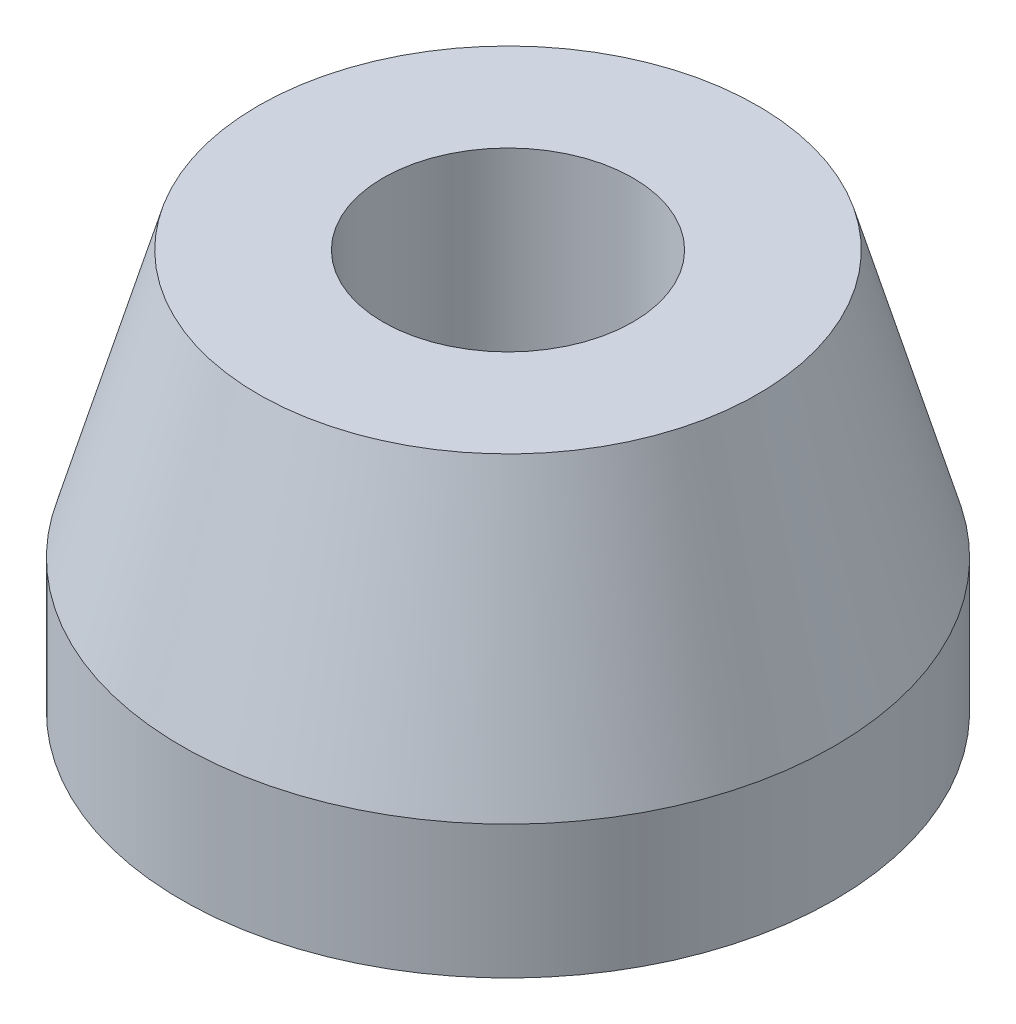
ISO-10303-21;
HEADER;
FILE_DESCRIPTION(('STEP AP214'),'2;1');
FILE_NAME('part.step','',(''),(''),'','','');
FILE_SCHEMA(('AUTOMOTIVE_DESIGN { 1 0 10303 214 1 1 1 1 }'));
ENDSEC;
DATA;
#1=APPLICATION_CONTEXT('core data for automotive mechanical design processes');
#2=APPLICATION_PROTOCOL_DEFINITION('international standard','automotive_design',2000,#1);
#3=PRODUCT_CONTEXT('',#1,'mechanical');
#4=PRODUCT('Part','Part','',(#3));
#5=PRODUCT_RELATED_PRODUCT_CATEGORY('part','',(#4));
#6=PRODUCT_DEFINITION_FORMATION('','',#4);
#7=PRODUCT_DEFINITION_CONTEXT('part definition',#1,'design');
#8=PRODUCT_DEFINITION('design','',#6,#7);
#9=PRODUCT_DEFINITION_SHAPE('','',#8);
#10=(LENGTH_UNIT() NAMED_UNIT(*) SI_UNIT(.MILLI.,.METRE.));
#11=(NAMED_UNIT(*) PLANE_ANGLE_UNIT() SI_UNIT($,.RADIAN.));
#12=(NAMED_UNIT(*) SI_UNIT($,.STERADIAN.) SOLID_ANGLE_UNIT());
#13=UNCERTAINTY_MEASURE_WITH_UNIT(LENGTH_MEASURE(1.E-05),#10,'distance_accuracy_value','');
#14=(GEOMETRIC_REPRESENTATION_CONTEXT(3) GLOBAL_UNCERTAINTY_ASSIGNED_CONTEXT((#13)) GLOBAL_UNIT_ASSIGNED_CONTEXT((#10,
#11,#12)) REPRESENTATION_CONTEXT('',''));
#15=CARTESIAN_POINT('',(0.,0.,0.));
#16=DIRECTION('',(0.,0.,1.));
#17=DIRECTION('',(1.,0.,0.));
#18=AXIS2_PLACEMENT_3D('',#15,#16,#17);
#19=CARTESIAN_POINT('',(0.,0.,0.));
#20=DIRECTION('',(0.,-1.,0.));
#21=DIRECTION('',(1.,0.,0.));
#22=AXIS2_PLACEMENT_3D('',#19,#20,#21);
#23=PLANE('',#22);
#24=CARTESIAN_POINT('',(0.,0.,0.));
#25=DIRECTION('',(0.,1.,0.));
#26=DIRECTION('',(-1.,0.,0.));
#27=AXIS2_PLACEMENT_3D('',#24,#25,#26);
#28=CIRCLE('',#27,4.7625);
#29=CARTESIAN_POINT('',(-4.7625,0.,0.));
#30=VERTEX_POINT('',#29);
#31=EDGE_CURVE('E55',#30,#30,#28,.T.);
#32=ORIENTED_EDGE('',*,*,#31,.T.);
#33=EDGE_LOOP('',(#32));
#34=FACE_BOUND('',#33,.T.);
#35=CARTESIAN_POINT('',(0.,0.,0.));
#36=DIRECTION('',(0.,1.,0.));
#37=DIRECTION('',(-1.,0.,0.));
#38=AXIS2_PLACEMENT_3D('',#35,#36,#37);
#39=CIRCLE('',#38,12.446);
#40=CARTESIAN_POINT('',(-12.446,0.,0.));
#41=VERTEX_POINT('',#40);
#42=EDGE_CURVE('E10',#41,#41,#39,.T.);
#43=ORIENTED_EDGE('',*,*,#42,.F.);
#44=EDGE_LOOP('',(#43));
#45=FACE_BOUND('',#44,.T.);
#46=ADVANCED_FACE('F39',(#34,#45),#23,.T.);
#47=CARTESIAN_POINT('',(0.,15.24,0.));
#48=DIRECTION('',(0.,1.,0.));
#49=DIRECTION('',(-1.,0.,0.));
#50=AXIS2_PLACEMENT_3D('',#47,#48,#49);
#51=CYLINDRICAL_SURFACE('',#50,12.446);
#52=ORIENTED_EDGE('',*,*,#42,.T.);
#53=EDGE_LOOP('',(#52));
#54=FACE_BOUND('',#53,.T.);
#55=CARTESIAN_POINT('',(0.,5.08,0.));
#56=DIRECTION('',(0.,1.,0.));
#57=DIRECTION('',(-1.,0.,0.));
#58=AXIS2_PLACEMENT_3D('',#55,#56,#57);
#59=CIRCLE('',#58,12.446);
#60=CARTESIAN_POINT('',(-12.446,5.08,0.));
#61=VERTEX_POINT('',#60);
#62=EDGE_CURVE('E46',#61,#61,#59,.T.);
#63=ORIENTED_EDGE('',*,*,#62,.F.);
#64=EDGE_LOOP('',(#63));
#65=FACE_BOUND('',#64,.T.);
#66=ADVANCED_FACE('F73',(#54,#65),#51,.T.);
#67=CARTESIAN_POINT('',(0.,15.24,0.));
#68=DIRECTION('',(0.,-1.,0.));
#69=DIRECTION('',(1.,0.,0.));
#70=AXIS2_PLACEMENT_3D('',#67,#68,#69);
#71=CONICAL_SURFACE('',#70,9.525,0.279949822523791);
#72=ORIENTED_EDGE('',*,*,#62,.T.);
#73=EDGE_LOOP('',(#72));
#74=FACE_BOUND('',#73,.T.);
#75=CARTESIAN_POINT('',(0.,15.24,0.));
#76=DIRECTION('',(0.,1.,0.));
#77=DIRECTION('',(-1.,0.,0.));
#78=AXIS2_PLACEMENT_3D('',#75,#76,#77);
#79=CIRCLE('',#78,9.525);
#80=CARTESIAN_POINT('',(-9.525,15.24,0.));
#81=VERTEX_POINT('',#80);
#82=EDGE_CURVE('E50',#81,#81,#79,.T.);
#83=ORIENTED_EDGE('',*,*,#82,.F.);
#84=EDGE_LOOP('',(#83));
#85=FACE_BOUND('',#84,.T.);
#86=ADVANCED_FACE('F68',(#74,#85),#71,.T.);
#87=CARTESIAN_POINT('',(-9.525,15.24,0.));
#88=DIRECTION('',(0.,1.,0.));
#89=DIRECTION('',(-1.,0.,0.));
#90=AXIS2_PLACEMENT_3D('',#87,#88,#89);
#91=PLANE('',#90);
#92=CARTESIAN_POINT('',(0.,15.24,0.));
#93=DIRECTION('',(0.,1.,0.));
#94=DIRECTION('',(-1.,0.,0.));
#95=AXIS2_PLACEMENT_3D('',#92,#93,#94);
#96=CIRCLE('',#95,4.7625);
#97=CARTESIAN_POINT('',(-4.7625,15.24,0.));
#98=VERTEX_POINT('',#97);
#99=EDGE_CURVE('E42',#98,#98,#96,.T.);
#100=ORIENTED_EDGE('',*,*,#99,.F.);
#101=EDGE_LOOP('',(#100));
#102=FACE_BOUND('',#101,.T.);
#103=ORIENTED_EDGE('',*,*,#82,.T.);
#104=EDGE_LOOP('',(#103));
#105=FACE_BOUND('',#104,.T.);
#106=ADVANCED_FACE('F65',(#102,#105),#91,.T.);
#107=CARTESIAN_POINT('',(0.,0.,0.));
#108=DIRECTION('',(0.,1.,0.));
#109=DIRECTION('',(-1.,0.,0.));
#110=AXIS2_PLACEMENT_3D('',#107,#108,#109);
#111=CYLINDRICAL_SURFACE('',#110,4.7625);
#112=CARTESIAN_POINT('',(-4.7625,15.24,0.));
#113=CARTESIAN_POINT('',(-4.7625,15.08125,0.));
#114=CARTESIAN_POINT('',(-4.7625,14.9225,0.));
#115=CARTESIAN_POINT('',(-4.7625,14.605,0.));
#116=CARTESIAN_POINT('',(-4.7625,14.44625,0.));
#117=CARTESIAN_POINT('',(-4.7625,14.12875,0.));
#118=CARTESIAN_POINT('',(-4.7625,13.97,0.));
#119=CARTESIAN_POINT('',(-4.7625,13.6525,0.));
#120=CARTESIAN_POINT('',(-4.7625,13.49375,0.));
#121=CARTESIAN_POINT('',(-4.7625,13.17625,0.));
#122=CARTESIAN_POINT('',(-4.7625,13.0175,0.));
#123=CARTESIAN_POINT('',(-4.7625,12.7,0.));
#124=CARTESIAN_POINT('',(-4.7625,12.54125,0.));
#125=CARTESIAN_POINT('',(-4.7625,12.22375,0.));
#126=CARTESIAN_POINT('',(-4.7625,12.065,0.));
#127=CARTESIAN_POINT('',(-4.7625,11.7475,0.));
#128=CARTESIAN_POINT('',(-4.7625,11.58875,0.));
#129=CARTESIAN_POINT('',(-4.7625,11.27125,0.));
#130=CARTESIAN_POINT('',(-4.7625,11.1125,0.));
#131=CARTESIAN_POINT('',(-4.7625,10.795,0.));
#132=CARTESIAN_POINT('',(-4.7625,10.63625,0.));
#133=CARTESIAN_POINT('',(-4.7625,10.31875,0.));
#134=CARTESIAN_POINT('',(-4.7625,10.16,0.));
#135=CARTESIAN_POINT('',(-4.7625,9.8425,0.));
#136=CARTESIAN_POINT('',(-4.7625,9.68374999999999,0.));
#137=CARTESIAN_POINT('',(-4.7625,9.36625,0.));
#138=CARTESIAN_POINT('',(-4.7625,9.2075,0.));
#139=CARTESIAN_POINT('',(-4.7625,8.89,0.));
#140=CARTESIAN_POINT('',(-4.7625,8.73125,0.));
#141=CARTESIAN_POINT('',(-4.7625,8.41374999999999,0.));
#142=CARTESIAN_POINT('',(-4.7625,8.255,0.));
#143=CARTESIAN_POINT('',(-4.7625,7.93749999999999,0.));
#144=CARTESIAN_POINT('',(-4.7625,7.77875,0.));
#145=CARTESIAN_POINT('',(-4.7625,7.46125,0.));
#146=CARTESIAN_POINT('',(-4.7625,7.3025,0.));
#147=CARTESIAN_POINT('',(-4.7625,6.985,0.));
#148=CARTESIAN_POINT('',(-4.7625,6.82625,0.));
#149=CARTESIAN_POINT('',(-4.7625,6.50875,0.));
#150=CARTESIAN_POINT('',(-4.7625,6.35,0.));
#151=CARTESIAN_POINT('',(-4.7625,6.0325,0.));
#152=CARTESIAN_POINT('',(-4.7625,5.87375,0.));
#153=CARTESIAN_POINT('',(-4.7625,5.55625,0.));
#154=CARTESIAN_POINT('',(-4.7625,5.3975,0.));
#155=CARTESIAN_POINT('',(-4.7625,5.08,0.));
#156=CARTESIAN_POINT('',(-4.7625,4.92125,0.));
#157=CARTESIAN_POINT('',(-4.7625,4.60375,0.));
#158=CARTESIAN_POINT('',(-4.7625,4.445,0.));
#159=CARTESIAN_POINT('',(-4.7625,4.1275,0.));
#160=CARTESIAN_POINT('',(-4.7625,3.96875,0.));
#161=CARTESIAN_POINT('',(-4.7625,3.65125,0.));
#162=CARTESIAN_POINT('',(-4.7625,3.4925,0.));
#163=CARTESIAN_POINT('',(-4.7625,3.175,0.));
#164=CARTESIAN_POINT('',(-4.7625,3.01625,0.));
#165=CARTESIAN_POINT('',(-4.7625,2.69875,0.));
#166=CARTESIAN_POINT('',(-4.7625,2.54,0.));
#167=CARTESIAN_POINT('',(-4.7625,2.2225,0.));
#168=CARTESIAN_POINT('',(-4.7625,2.06375,0.));
#169=CARTESIAN_POINT('',(-4.7625,1.74625,0.));
#170=CARTESIAN_POINT('',(-4.7625,1.5875,0.));
#171=CARTESIAN_POINT('',(-4.7625,1.27,0.));
#172=CARTESIAN_POINT('',(-4.7625,1.11125,0.));
#173=CARTESIAN_POINT('',(-4.7625,0.793749999999997,0.));
#174=CARTESIAN_POINT('',(-4.7625,0.634999999999997,0.));
#175=CARTESIAN_POINT('',(-4.7625,0.317499999999997,0.));
#176=CARTESIAN_POINT('',(-4.7625,0.158749999999997,0.));
#177=CARTESIAN_POINT('',(-4.7625,0.,0.));
#178=B_SPLINE_CURVE_WITH_KNOTS('',3,(#112,#113,#114,#115,#116,#117,#118,#119,#120,#121,#122,
#123,#124,#125,#126,#127,#128,#129,#130,#131,#132,#133,#134,#135,#136,#137,#138,#139,#140,#141,
#142,#143,#144,#145,#146,#147,#148,#149,#150,#151,#152,#153,#154,#155,#156,#157,#158,#159,#160,
#161,#162,#163,#164,#165,#166,#167,#168,#169,#170,#171,#172,#173,#174,#175,#176,#177),
.UNSPECIFIED.,.F.,.F.,(4,2,2,2,2,2,2,2,2,2,2,2,2,2,2,2,2,2,2,2,2,2,2,2,2,2,2,2,2,2,2,2,4),(0.,
0.476249999999999,0.9525,1.42875,1.905,2.38125,2.8575,3.33375,3.81,4.28625,4.7625,5.23875,5.715,
6.19125,6.6675,7.14375,7.62,8.09625,8.5725,9.04875,9.525,10.00125,10.4775,10.95375,11.43,
11.90625,12.3825,12.85875,13.335,13.81125,14.2875,14.76375,15.24),.UNSPECIFIED.);
#179=EDGE_CURVE('BSEAM62',#98,#30,#178,.T.);
#180=ORIENTED_EDGE('',*,*,#99,.T.);
#181=ORIENTED_EDGE('',*,*,#31,.F.);
#182=ORIENTED_EDGE('',*,*,#179,.T.);
#183=ORIENTED_EDGE('',*,*,#179,.F.);
#184=EDGE_LOOP('',(#180,#182,#181,#183));
#185=FACE_BOUND('',#184,.T.);
#186=ADVANCED_FACE('F62',(#185),#111,.F.);
#187=CLOSED_SHELL('',(#46,#66,#86,#106,#186));
#188=MANIFOLD_SOLID_BREP('B2',#187);
#189=ADVANCED_BREP_SHAPE_REPRESENTATION('',(#18,#188),#14);
#190=SHAPE_DEFINITION_REPRESENTATION(#9,#189);
ENDSEC;
END-ISO-10303-21;
